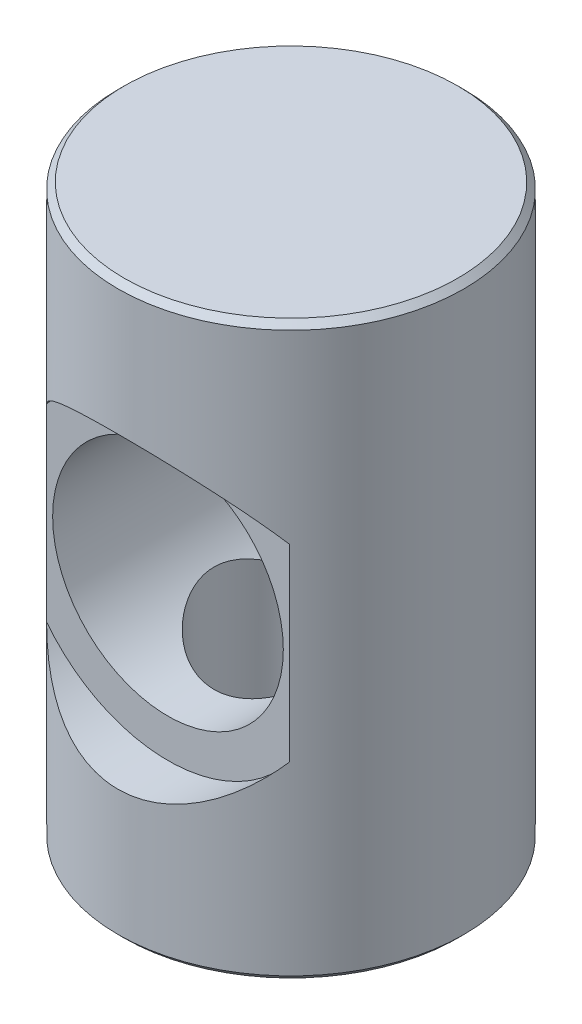
ISO-10303-21;
HEADER;
FILE_DESCRIPTION(('STEP AP214'),'2;1');
FILE_NAME('part.step','',(''),(''),'','','');
FILE_SCHEMA(('AUTOMOTIVE_DESIGN { 1 0 10303 214 1 1 1 1 }'));
ENDSEC;
DATA;
#1=APPLICATION_CONTEXT('core data for automotive mechanical design processes');
#2=APPLICATION_PROTOCOL_DEFINITION('international standard','automotive_design',2000,#1);
#3=PRODUCT_CONTEXT('',#1,'mechanical');
#4=PRODUCT('Part','Part','',(#3));
#5=PRODUCT_RELATED_PRODUCT_CATEGORY('part','',(#4));
#6=PRODUCT_DEFINITION_FORMATION('','',#4);
#7=PRODUCT_DEFINITION_CONTEXT('part definition',#1,'design');
#8=PRODUCT_DEFINITION('design','',#6,#7);
#9=PRODUCT_DEFINITION_SHAPE('','',#8);
#10=(LENGTH_UNIT() NAMED_UNIT(*) SI_UNIT(.MILLI.,.METRE.));
#11=(NAMED_UNIT(*) PLANE_ANGLE_UNIT() SI_UNIT($,.RADIAN.));
#12=(NAMED_UNIT(*) SI_UNIT($,.STERADIAN.) SOLID_ANGLE_UNIT());
#13=UNCERTAINTY_MEASURE_WITH_UNIT(LENGTH_MEASURE(1.E-05),#10,'distance_accuracy_value','');
#14=(GEOMETRIC_REPRESENTATION_CONTEXT(3) GLOBAL_UNCERTAINTY_ASSIGNED_CONTEXT((#13)) GLOBAL_UNIT_ASSIGNED_CONTEXT((#10,
#11,#12)) REPRESENTATION_CONTEXT('',''));
#15=CARTESIAN_POINT('',(0.,0.,0.));
#16=DIRECTION('',(0.,0.,1.));
#17=DIRECTION('',(1.,0.,0.));
#18=AXIS2_PLACEMENT_3D('',#15,#16,#17);
#19=CARTESIAN_POINT('',(0.,11.7983,-7.1755));
#20=DIRECTION('',(0.,0.,1.));
#21=DIRECTION('',(1.,0.,0.));
#22=AXIS2_PLACEMENT_3D('',#19,#20,#21);
#23=CYLINDRICAL_SURFACE('',#22,4.7625);
#24=CARTESIAN_POINT('',(0.,7.0358,-3.175));
#25=CARTESIAN_POINT('',(-0.159513506146526,7.03580170441228,-3.17499785387674));
#26=CARTESIAN_POINT('',(-0.319036822940597,7.04388414018071,-3.16291201378244));
#27=CARTESIAN_POINT('',(-0.632990333269339,7.07541300858027,-3.1153157875296));
#28=CARTESIAN_POINT('',(-0.787418072256469,7.0988667352998,-3.0797942804673));
#29=CARTESIAN_POINT('',(-1.08618661185831,7.15882376063535,-2.98750378332687));
#30=CARTESIAN_POINT('',(-1.23057094564588,7.19526592065314,-2.93083428235375));
#31=CARTESIAN_POINT('',(-1.50719688917279,7.27827251582952,-2.79866196869855));
#32=CARTESIAN_POINT('',(-1.63943673208792,7.32483842051905,-2.72315642160038));
#33=CARTESIAN_POINT('',(-1.90068942785739,7.42906615994305,-2.54848209446027));
#34=CARTESIAN_POINT('',(-2.0284762255929,7.48733425461648,-2.44784901636422));
#35=CARTESIAN_POINT('',(-2.26651828028912,7.60758077610647,-2.22927855246795));
#36=CARTESIAN_POINT('',(-2.37674794067855,7.66956444202943,-2.11131637522972));
#37=CARTESIAN_POINT('',(-2.59432897361932,7.80211379944657,-1.83982936485523));
#38=CARTESIAN_POINT('',(-2.69848308269039,7.87249079681213,-1.68363002512645));
#39=CARTESIAN_POINT('',(-2.87893691841686,8.00283916044992,-1.35197313839848));
#40=CARTESIAN_POINT('',(-2.95528481583058,8.06282842664271,-1.17654958761289));
#41=CARTESIAN_POINT('',(-3.0587003056751,8.14742676712153,-0.862470821626497));
#42=CARTESIAN_POINT('',(-3.09363184983488,8.17725015723145,-0.727823581043087));
#43=CARTESIAN_POINT('',(-3.14564105737718,8.22232973163047,-0.45284309874219));
#44=CARTESIAN_POINT('',(-3.16274949511548,8.23761102114805,-0.312520093909081));
#45=CARTESIAN_POINT('',(-3.17803790572636,8.25124388601104,-0.0294087885536102));
#46=CARTESIAN_POINT('',(-3.17614050629003,8.24952625951566,0.113387224758054));
#47=CARTESIAN_POINT('',(-3.1533716036927,8.22928606406863,0.396295520403466));
#48=CARTESIAN_POINT('',(-3.13248402562585,8.21074925795638,0.536405426371805));
#49=CARTESIAN_POINT('',(-3.07443178311275,8.16090592287372,0.804016443958597));
#50=CARTESIAN_POINT('',(-3.03802591942409,8.13019887455108,0.931801121179951));
#51=CARTESIAN_POINT('',(-2.95068813219861,8.05958473764861,1.17955010979676));
#52=CARTESIAN_POINT('',(-2.89975142875274,8.01967462255611,1.29951183185714));
#53=CARTESIAN_POINT('',(-2.77294687249444,7.92536838190116,1.55420281498847));
#54=CARTESIAN_POINT('',(-2.69411533030023,7.86967695570595,1.68697259197917));
#55=CARTESIAN_POINT('',(-2.51886974692605,7.75507183864348,1.93894614005392));
#56=CARTESIAN_POINT('',(-2.42243402035992,7.69615423703663,2.05813288170832));
#57=CARTESIAN_POINT('',(-2.19045099950254,7.56692441769347,2.30591129113202));
#58=CARTESIAN_POINT('',(-2.05095377025594,7.49689342754584,2.43099280228032));
#59=CARTESIAN_POINT('',(-1.74943769853673,7.36571265195501,2.6561994350834));
#60=CARTESIAN_POINT('',(-1.58744015020742,7.304554579841,2.75634790583761));
#61=CARTESIAN_POINT('',(-1.2777118005163,7.20811671006251,2.91064587831312));
#62=CARTESIAN_POINT('',(-1.13340775885306,7.17011422899626,2.96996383930038));
#63=CARTESIAN_POINT('',(-0.835082219747428,7.10711496039162,3.06721656943045));
#64=CARTESIAN_POINT('',(-0.681069057915085,7.08210718247545,3.10516941057244));
#65=CARTESIAN_POINT('',(-0.366689406911035,7.04729537076046,3.15779334981527));
#66=CARTESIAN_POINT('',(-0.206298501445476,7.03755700592861,3.17236389423949));
#67=CARTESIAN_POINT('',(0.115000912030582,7.03448054992834,3.17697975309251));
#68=CARTESIAN_POINT('',(0.275909383071217,7.04114131225305,3.16702678202589));
#69=CARTESIAN_POINT('',(0.581748451061771,7.06914401788967,3.12479681179543));
#70=CARTESIAN_POINT('',(0.727007443428385,7.08942183855522,3.09413703981371));
#71=CARTESIAN_POINT('',(1.00983477297833,7.14186961760315,3.01371684845446));
#72=CARTESIAN_POINT('',(1.14740187964354,7.17404147251632,2.963953382901));
#73=CARTESIAN_POINT('',(1.42028029136544,7.25017040359987,2.84376447844169));
#74=CARTESIAN_POINT('',(1.55495019310494,7.29472331159536,2.77227005539697));
#75=CARTESIAN_POINT('',(1.81083430052963,7.39137054216631,2.61233715220837));
#76=CARTESIAN_POINT('',(1.93204012275933,7.44346951733385,2.52388820764801));
#77=CARTESIAN_POINT('',(2.17781894704302,7.56039657188094,2.31678500930826));
#78=CARTESIAN_POINT('',(2.29989360271144,7.625934760814,2.19556606216409));
#79=CARTESIAN_POINT('',(2.52307674305786,7.75698262724378,1.93498560490977));
#80=CARTESIAN_POINT('',(2.62417073664107,7.8224922540543,1.79561166279185));
#81=CARTESIAN_POINT('',(2.79598082787364,7.94163259639917,1.51266141984501));
#82=CARTESIAN_POINT('',(2.86854322403869,7.99579939742189,1.37043789728911));
#83=CARTESIAN_POINT('',(2.99237739257787,8.09245628332026,1.07335216383611));
#84=CARTESIAN_POINT('',(3.04368748566418,8.13496733782862,0.918513308918403));
#85=CARTESIAN_POINT('',(3.11524401668582,8.19573532072438,0.627753877826358));
#86=CARTESIAN_POINT('',(3.13941774208684,8.21697940854533,0.493439756093285));
#87=CARTESIAN_POINT('',(3.17022488831674,8.24421346815997,0.221339911640263));
#88=CARTESIAN_POINT('',(3.17687736084457,8.25022000820852,0.0835581242544801));
#89=CARTESIAN_POINT('',(3.17220478264998,8.24604331464361,-0.191520836727935));
#90=CARTESIAN_POINT('',(3.16086908702961,8.23585049469368,-0.328817675150232));
#91=CARTESIAN_POINT('',(3.12097725174618,8.20085903858056,-0.59903291065416));
#92=CARTESIAN_POINT('',(3.09239813794198,8.1760409175349,-0.73194521642847));
#93=CARTESIAN_POINT('',(3.00978981561158,8.10693649259347,-1.02506622898967));
#94=CARTESIAN_POINT('',(2.9510082914772,8.0592247898744,-1.18311132192875));
#95=CARTESIAN_POINT('',(2.8112152810101,7.95302260599703,-1.48508652360585));
#96=CARTESIAN_POINT('',(2.73017258412971,7.89451702973858,-1.62899642711669));
#97=CARTESIAN_POINT('',(2.54632873237354,7.77212940973668,-1.90385549633635));
#98=CARTESIAN_POINT('',(2.44315837250286,7.70816888579323,-2.03452106373605));
#99=CARTESIAN_POINT('',(2.21726660759133,7.58144224984467,-2.27859138405742));
#100=CARTESIAN_POINT('',(2.09453921249742,7.51867651040067,-2.3919908277243));
#101=CARTESIAN_POINT('',(1.88738506601081,7.42496501861292,-2.55491858498312));
#102=CARTESIAN_POINT('',(1.80901344364311,7.39188687451114,-2.61102761986732));
#103=CARTESIAN_POINT('',(1.64665981934885,7.32868094277056,-2.71633779885705));
#104=CARTESIAN_POINT('',(1.56268042207705,7.29855180121786,-2.76554211752335));
#105=CARTESIAN_POINT('',(1.38960715113394,7.24213172927475,-2.85642356224378));
#106=CARTESIAN_POINT('',(1.30051812806184,7.21583723997834,-2.89810767636216));
#107=CARTESIAN_POINT('',(1.11782960098097,7.16787943004951,-2.97335672820606));
#108=CARTESIAN_POINT('',(1.02423169482463,7.14621448338661,-3.00692451716839));
#109=CARTESIAN_POINT('',(0.780235392827382,7.09771890347634,-3.08154139984118));
#110=CARTESIAN_POINT('',(0.627104096318101,7.07467896131736,-3.11642765689178));
#111=CARTESIAN_POINT('',(0.315982580686497,7.04372434712666,-3.16314936096945));
#112=CARTESIAN_POINT('',(0.157996102785211,7.03579831180127,-3.17500212570784));
#113=CARTESIAN_POINT('',(0.,7.0358,-3.175));
#114=B_SPLINE_CURVE_WITH_KNOTS('',3,(#24,#25,#26,#27,#28,#29,#30,#31,#32,#33,#34,#35,#36,#37,
#38,#39,#40,#41,#42,#43,#44,#45,#46,#47,#48,#49,#50,#51,#52,#53,#54,#55,#56,#57,#58,#59,#60,#61,
#62,#63,#64,#65,#66,#67,#68,#69,#70,#71,#72,#73,#74,#75,#76,#77,#78,#79,#80,#81,#82,#83,#84,#85,
#86,#87,#88,#89,#90,#91,#92,#93,#94,#95,#96,#97,#98,#99,#100,#101,#102,#103,#104,#105,#106,#107,
#108,#109,#110,#111,#112,#113),.UNSPECIFIED.,.T.,.F.,(4,2,2,2,2,2,2,2,2,2,2,2,2,2,2,2,2,2,2,2,2,
2,2,2,2,2,2,2,2,2,2,2,2,2,2,2,2,2,2,2,2,2,2,2,4),(0.,0.477921997077322,0.956070945278542,
1.43199826818949,1.90799472139476,2.42438283538384,2.94151703421856,3.54023109732372,
4.13790297394634,4.56300988710696,4.98738156455222,5.41348154879912,5.83994255655571,
6.24758818745149,6.6553680680092,7.14609274784494,7.63742604761198,8.23466340273952,
8.8313393398877,9.31106989228961,9.79039404549573,10.2717740223998,10.7531203456965,
11.2006552211841,11.6482614879236,12.1229810060221,12.5979944723587,13.1481222963466,
13.6986288317687,14.2025677230621,14.7055939480251,15.1181442623597,15.5302458053914,
15.9425913096208,16.3554874162604,16.8784049132826,17.4020593249786,17.9352455177248,
18.4685953331297,18.7739424593009,19.0791487337135,19.3840699212457,19.6888838348845,
20.1626158186784,20.635991489477),.UNSPECIFIED.);
#115=CARTESIAN_POINT('',(0.,7.0358,-3.175));
#116=VERTEX_POINT('',#115);
#117=EDGE_CURVE('E270',#116,#116,#114,.T.);
#118=ORIENTED_EDGE('',*,*,#117,.F.);
#119=EDGE_LOOP('',(#118));
#120=FACE_BOUND('',#119,.T.);
#121=CARTESIAN_POINT('',(0.,11.7983,5.08));
#122=DIRECTION('',(0.,0.,1.));
#123=DIRECTION('',(1.,0.,0.));
#124=AXIS2_PLACEMENT_3D('',#121,#122,#123);
#125=CIRCLE('',#124,4.7625);
#126=CARTESIAN_POINT('',(4.7625,11.7983,5.08));
#127=VERTEX_POINT('',#126);
#128=EDGE_CURVE('E103',#127,#127,#125,.F.);
#129=ORIENTED_EDGE('',*,*,#128,.F.);
#130=EDGE_LOOP('',(#129));
#131=FACE_BOUND('',#130,.T.);
#132=CARTESIAN_POINT('',(0.,11.7983,-5.08));
#133=DIRECTION('',(0.,0.,-1.));
#134=DIRECTION('',(-1.,0.,0.));
#135=AXIS2_PLACEMENT_3D('',#132,#133,#134);
#136=CIRCLE('',#135,4.7625);
#137=CARTESIAN_POINT('',(-4.7625,11.7983,-5.08));
#138=VERTEX_POINT('',#137);
#139=EDGE_CURVE('E93',#138,#138,#136,.F.);
#140=ORIENTED_EDGE('',*,*,#139,.F.);
#141=EDGE_LOOP('',(#140));
#142=FACE_BOUND('',#141,.T.);
#143=ADVANCED_FACE('F34',(#120,#131,#142),#23,.F.);
#144=CARTESIAN_POINT('',(0.,23.5966,0.));
#145=DIRECTION('',(0.,-1.,0.));
#146=DIRECTION('',(0.,0.,-1.));
#147=AXIS2_PLACEMENT_3D('',#144,#145,#146);
#148=CYLINDRICAL_SURFACE('',#147,7.1374);
#149=CARTESIAN_POINT('',(0.,0.254000000000029,0.));
#150=DIRECTION('',(0.,1.,0.));
#151=DIRECTION('',(0.,0.,1.));
#152=AXIS2_PLACEMENT_3D('',#149,#150,#151);
#153=CIRCLE('',#152,7.1374);
#154=CARTESIAN_POINT('',(0.,0.254000000000029,7.1374));
#155=VERTEX_POINT('',#154);
#156=EDGE_CURVE('E108',#155,#155,#153,.T.);
#157=ORIENTED_EDGE('',*,*,#156,.T.);
#158=EDGE_LOOP('',(#157));
#159=FACE_BOUND('',#158,.T.);
#160=CARTESIAN_POINT('',(0.,23.3426,0.));
#161=DIRECTION('',(0.,1.,0.));
#162=DIRECTION('',(0.,0.,1.));
#163=AXIS2_PLACEMENT_3D('',#160,#161,#162);
#164=CIRCLE('',#163,7.1374);
#165=CARTESIAN_POINT('',(0.,23.3426,7.1374));
#166=VERTEX_POINT('',#165);
#167=EDGE_CURVE('E117',#166,#166,#164,.F.);
#168=ORIENTED_EDGE('',*,*,#167,.T.);
#169=EDGE_LOOP('',(#168));
#170=FACE_BOUND('',#169,.T.);
#171=CARTESIAN_POINT('',(-5.01358940879685,7.90132409040035,-5.08));
#172=CARTESIAN_POINT('',(-4.90648502878149,7.7635854557502,-5.18572112331707));
#173=CARTESIAN_POINT('',(-4.79340126510848,7.62976711896911,-5.29062160918102));
#174=CARTESIAN_POINT('',(-4.55495119495651,7.37042044768733,-5.49725219651464));
#175=CARTESIAN_POINT('',(-4.42956630516229,7.24490515077608,-5.59897718542717));
#176=CARTESIAN_POINT('',(-4.16534261279244,7.00195995764851,-5.79827942274049));
#177=CARTESIAN_POINT('',(-4.02639358636565,6.88461234622421,-5.89581147762958));
#178=CARTESIAN_POINT('',(-3.73603214738952,6.66038346600335,-6.08394902937854));
#179=CARTESIAN_POINT('',(-3.58462764087743,6.55349565083927,-6.17455885069701));
#180=CARTESIAN_POINT('',(-3.30484095874253,6.37413138754628,-6.32771116138449));
#181=CARTESIAN_POINT('',(-3.17890733179915,6.29931260825521,-6.39199186687382));
#182=CARTESIAN_POINT('',(-2.91986390451783,6.1574943321378,-6.51439819586154));
#183=CARTESIAN_POINT('',(-2.78675581887783,6.09049297895258,-6.57252528031964));
#184=CARTESIAN_POINT('',(-2.51408311019655,5.96526186954583,-6.68156925084875));
#185=CARTESIAN_POINT('',(-2.37453585805806,5.90701013276477,-6.73250418486546));
#186=CARTESIAN_POINT('',(-2.08934089764727,5.79993872343358,-6.82639397690769));
#187=CARTESIAN_POINT('',(-1.94369640414868,5.75111415475468,-6.86935297689583));
#188=CARTESIAN_POINT('',(-1.64553210440703,5.66322656410037,-6.94684607284315));
#189=CARTESIAN_POINT('',(-1.4929564949888,5.62427049120682,-6.9812877752731));
#190=CARTESIAN_POINT('',(-1.18349538064518,5.55755583556956,-7.04035693557952));
#191=CARTESIAN_POINT('',(-1.02660982587839,5.52979738237651,-7.06498427990892));
#192=CARTESIAN_POINT('',(-0.709944239539988,5.48608801235782,-7.10379460252081));
#193=CARTESIAN_POINT('',(-0.550164702351688,5.47013509790566,-7.11797934780339));
#194=CARTESIAN_POINT('',(-0.229273485295923,5.45040573077873,-7.13552517406307));
#195=CARTESIAN_POINT('',(-0.0681620062038429,5.44662747529184,-7.13888785756089));
#196=CARTESIAN_POINT('',(0.230766370769881,5.45099296800301,-7.13500426528504));
#197=CARTESIAN_POINT('',(0.368630338438482,5.45751415121553,-7.12920184013348));
#198=CARTESIAN_POINT('',(0.6431307810693,5.47945159506404,-7.10969750208706));
#199=CARTESIAN_POINT('',(0.779766849102553,5.49487070155182,-7.09599306186613));
#200=CARTESIAN_POINT('',(1.05070985095515,5.53433676593677,-7.06095823796117));
#201=CARTESIAN_POINT('',(1.18501810993927,5.55837863386231,-7.03963235320292));
#202=CARTESIAN_POINT('',(1.45054761727503,5.61470361470149,-6.9897549592306));
#203=CARTESIAN_POINT('',(1.58176766356226,5.64698988058266,-6.96120068564527));
#204=CARTESIAN_POINT('',(1.96800874114835,5.75508252052344,-6.86580612170238));
#205=CARTESIAN_POINT('',(2.21747402764985,5.84240339109374,-6.78898310323563));
#206=CARTESIAN_POINT('',(2.69706982116865,6.04363474646974,-6.61315009165441));
#207=CARTESIAN_POINT('',(2.92718188163154,6.15757021698519,-6.51411925341828));
#208=CARTESIAN_POINT('',(3.30732336353376,6.37442563536606,-6.32741826965322));
#209=CARTESIAN_POINT('',(3.46234707064988,6.47218382464702,-6.24375842699735));
#210=CARTESIAN_POINT('',(3.7605476018623,6.678374219184,-6.06882487582275));
#211=CARTESIAN_POINT('',(3.90372369116022,6.78680708557983,-5.9775506957609));
#212=CARTESIAN_POINT('',(4.17814401405553,7.01319072783886,-5.78906859105549));
#213=CARTESIAN_POINT('',(4.30938568729903,7.13114353586888,-5.69185940058389));
#214=CARTESIAN_POINT('',(4.55994561370261,7.37562905751948,-5.49316976050202));
#215=CARTESIAN_POINT('',(4.67927004152543,7.50215727033194,-5.39169156193111));
#216=CARTESIAN_POINT('',(4.83088286586266,7.67659470989879,-5.25430357798406));
#217=CARTESIAN_POINT('',(4.86838888602788,7.72096543118581,-5.21956343792526));
#218=CARTESIAN_POINT('',(4.94200849827078,7.81051812940347,-5.14991187275229));
#219=CARTESIAN_POINT('',(4.97812467523291,7.85569834596996,-5.11500091676728));
#220=CARTESIAN_POINT('',(5.0135894087969,7.90132409040031,-5.08));
#221=B_SPLINE_CURVE_WITH_KNOTS('',3,(#171,#172,#173,#174,#175,#176,#177,#178,#179,#180,#181,
#182,#183,#184,#185,#186,#187,#188,#189,#190,#191,#192,#193,#194,#195,#196,#197,#198,#199,#200,
#201,#202,#203,#204,#205,#206,#207,#208,#209,#210,#211,#212,#213,#214,#215,#216,#217,#218,#219,
#220),.UNSPECIFIED.,.F.,.F.,(4,2,2,2,2,2,2,2,2,2,2,2,2,2,2,2,2,2,2,2,2,2,2,2,4),(0.,
0.612006445663398,1.2249521193373,1.84337572784972,2.46140978061607,2.94088458183679,
3.42024529222186,3.89838086544293,4.37626744047922,4.85913060401934,5.34199935387605,
5.82478637835434,6.30750190889455,6.7214125983357,7.13545574361017,7.54925488252654,
7.96321251141351,8.78549152442383,9.60854561525155,10.2121657150913,10.8158232238985,
11.419609934532,12.0230821652517,12.2261478476827,12.4288155525972),.UNSPECIFIED.);
#222=CARTESIAN_POINT('',(-5.01358940879685,7.90132409040035,-5.08));
#223=VERTEX_POINT('',#222);
#224=CARTESIAN_POINT('',(5.01358940879685,7.90132409040035,-5.08));
#225=VERTEX_POINT('',#224);
#226=EDGE_CURVE('E11',#223,#225,#221,.T.);
#227=ORIENTED_EDGE('',*,*,#226,.T.);
#228=DIRECTION('',(0.,-1.,0.));
#229=VECTOR('',#228,1.);
#230=CARTESIAN_POINT('',(5.01358940879685,23.5966,-5.08));
#231=LINE('',#230,#229);
#232=CARTESIAN_POINT('',(5.01358940879685,15.6952759095996,-5.08));
#233=VERTEX_POINT('',#232);
#234=EDGE_CURVE('E91',#233,#225,#231,.T.);
#235=ORIENTED_EDGE('',*,*,#234,.F.);
#236=CARTESIAN_POINT('',(5.01358940879685,15.6952759095996,-5.08));
#237=CARTESIAN_POINT('',(4.90648502878149,15.8330145442498,-5.18572112331707));
#238=CARTESIAN_POINT('',(4.79340126510848,15.9668328810309,-5.29062160918102));
#239=CARTESIAN_POINT('',(4.55495119495651,16.2261795523127,-5.49725219651464));
#240=CARTESIAN_POINT('',(4.42956630516229,16.3516948492239,-5.59897718542717));
#241=CARTESIAN_POINT('',(4.16534261279244,16.5946400423515,-5.79827942274049));
#242=CARTESIAN_POINT('',(4.02639358636565,16.7119876537758,-5.89581147762958));
#243=CARTESIAN_POINT('',(3.73603214738952,16.9362165339966,-6.08394902937854));
#244=CARTESIAN_POINT('',(3.58462764087743,17.0431043491607,-6.174558850697));
#245=CARTESIAN_POINT('',(3.30484095874253,17.2224686124537,-6.32771116138449));
#246=CARTESIAN_POINT('',(3.17890733179915,17.2972873917448,-6.39199186687382));
#247=CARTESIAN_POINT('',(2.91986390451783,17.4391056678622,-6.51439819586154));
#248=CARTESIAN_POINT('',(2.78675581887783,17.5061070210474,-6.57252528031964));
#249=CARTESIAN_POINT('',(2.51408311019655,17.6313381304542,-6.68156925084875));
#250=CARTESIAN_POINT('',(2.37453585805806,17.6895898672352,-6.73250418486546));
#251=CARTESIAN_POINT('',(2.08934089764727,17.7966612765664,-6.82639397690769));
#252=CARTESIAN_POINT('',(1.94369640414868,17.8454858452453,-6.86935297689583));
#253=CARTESIAN_POINT('',(1.64553210440703,17.9333734358996,-6.94684607284315));
#254=CARTESIAN_POINT('',(1.4929564949888,17.9723295087932,-6.9812877752731));
#255=CARTESIAN_POINT('',(1.18349538064518,18.0390441644304,-7.04035693557952));
#256=CARTESIAN_POINT('',(1.02660982587839,18.0668026176235,-7.06498427990892));
#257=CARTESIAN_POINT('',(0.709944239539987,18.1105119876422,-7.10379460252081));
#258=CARTESIAN_POINT('',(0.550164702351688,18.1264649020943,-7.11797934780339));
#259=CARTESIAN_POINT('',(0.229273485295923,18.1461942692213,-7.13552517406307));
#260=CARTESIAN_POINT('',(0.0681620062038422,18.1499725247082,-7.13888785756089));
#261=CARTESIAN_POINT('',(-0.230766370769882,18.145607031997,-7.13500426528504));
#262=CARTESIAN_POINT('',(-0.368630338438483,18.1390858487845,-7.12920184013348));
#263=CARTESIAN_POINT('',(-0.643130781069301,18.117148404936,-7.10969750208706));
#264=CARTESIAN_POINT('',(-0.779766849102554,18.1017292984482,-7.09599306186613));
#265=CARTESIAN_POINT('',(-1.05070985095516,18.0622632340632,-7.06095823796117));
#266=CARTESIAN_POINT('',(-1.18501810993928,18.0382213661377,-7.03963235320292));
#267=CARTESIAN_POINT('',(-1.45054761727503,17.9818963852985,-6.9897549592306));
#268=CARTESIAN_POINT('',(-1.58176766356226,17.9496101194173,-6.96120068564527));
#269=CARTESIAN_POINT('',(-1.96800874114835,17.8415174794766,-6.86580612170238));
#270=CARTESIAN_POINT('',(-2.21747402764985,17.7541966089063,-6.78898310323563));
#271=CARTESIAN_POINT('',(-2.69706982116865,17.5529652535303,-6.61315009165441));
#272=CARTESIAN_POINT('',(-2.92718188163154,17.4390297830148,-6.51411925341828));
#273=CARTESIAN_POINT('',(-3.30732336353376,17.2221743646339,-6.32741826965322));
#274=CARTESIAN_POINT('',(-3.46234707064988,17.124416175353,-6.24375842699735));
#275=CARTESIAN_POINT('',(-3.7605476018623,16.918225780816,-6.06882487582275));
#276=CARTESIAN_POINT('',(-3.90372369116022,16.8097929144202,-5.9775506957609));
#277=CARTESIAN_POINT('',(-4.17814401405552,16.5834092721611,-5.78906859105549));
#278=CARTESIAN_POINT('',(-4.30938568729903,16.4654564641311,-5.69185940058389));
#279=CARTESIAN_POINT('',(-4.55994561370261,16.2209709424805,-5.49316976050203));
#280=CARTESIAN_POINT('',(-4.67927004152543,16.0944427296681,-5.39169156193111));
#281=CARTESIAN_POINT('',(-4.83088286586265,15.9200052901012,-5.25430357798406));
#282=CARTESIAN_POINT('',(-4.86838888602788,15.8756345688142,-5.21956343792526));
#283=CARTESIAN_POINT('',(-4.94200849827078,15.7860818705965,-5.14991187275229));
#284=CARTESIAN_POINT('',(-4.97812467523291,15.74090165403,-5.11500091676728));
#285=CARTESIAN_POINT('',(-5.0135894087969,15.6952759095997,-5.08));
#286=B_SPLINE_CURVE_WITH_KNOTS('',3,(#236,#237,#238,#239,#240,#241,#242,#243,#244,#245,#246,
#247,#248,#249,#250,#251,#252,#253,#254,#255,#256,#257,#258,#259,#260,#261,#262,#263,#264,#265,
#266,#267,#268,#269,#270,#271,#272,#273,#274,#275,#276,#277,#278,#279,#280,#281,#282,#283,#284,
#285),.UNSPECIFIED.,.F.,.F.,(4,2,2,2,2,2,2,2,2,2,2,2,2,2,2,2,2,2,2,2,2,2,2,2,4),(0.,
0.612006445663398,1.2249521193373,1.84337572784972,2.46140978061607,2.94088458183679,
3.42024529222186,3.89838086544293,4.37626744047922,4.85913060401934,5.34199935387605,
5.82478637835434,6.30750190889455,6.7214125983357,7.13545574361017,7.54925488252654,
7.96321251141351,8.78549152442383,9.60854561525155,10.2121657150913,10.8158232238984,
11.419609934532,12.0230821652517,12.2261478476827,12.4288155525972),.UNSPECIFIED.);
#287=CARTESIAN_POINT('',(-5.01358940879685,15.6952759095996,-5.08));
#288=VERTEX_POINT('',#287);
#289=EDGE_CURVE('E49',#233,#288,#286,.T.);
#290=ORIENTED_EDGE('',*,*,#289,.T.);
#291=DIRECTION('',(0.,-1.,0.));
#292=VECTOR('',#291,1.);
#293=CARTESIAN_POINT('',(-5.01358940879685,23.5966,-5.08));
#294=LINE('',#293,#292);
#295=EDGE_CURVE('E92',#223,#288,#294,.F.);
#296=ORIENTED_EDGE('',*,*,#295,.F.);
#297=EDGE_LOOP('',(#227,#235,#290,#296));
#298=FACE_BOUND('',#297,.T.);
#299=DIRECTION('',(0.,-1.,0.));
#300=VECTOR('',#299,1.);
#301=CARTESIAN_POINT('',(-5.01358940879685,23.5966,5.08));
#302=LINE('',#301,#300);
#303=CARTESIAN_POINT('',(-5.01358940879685,15.6952759095996,5.08));
#304=VERTEX_POINT('',#303);
#305=CARTESIAN_POINT('',(-5.01358940879685,7.90132409040035,5.08));
#306=VERTEX_POINT('',#305);
#307=EDGE_CURVE('E106',#304,#306,#302,.T.);
#308=ORIENTED_EDGE('',*,*,#307,.F.);
#309=CARTESIAN_POINT('',(5.01358940879685,15.6952759095996,5.08));
#310=CARTESIAN_POINT('',(4.90648502878149,15.8330145442498,5.18572112331707));
#311=CARTESIAN_POINT('',(4.79340126510848,15.9668328810309,5.29062160918102));
#312=CARTESIAN_POINT('',(4.55495119495651,16.2261795523127,5.49725219651464));
#313=CARTESIAN_POINT('',(4.42956630516229,16.3516948492239,5.59897718542717));
#314=CARTESIAN_POINT('',(4.16534261279244,16.5946400423515,5.79827942274049));
#315=CARTESIAN_POINT('',(4.02639358636565,16.7119876537758,5.89581147762958));
#316=CARTESIAN_POINT('',(3.73603214738952,16.9362165339966,6.08394902937854));
#317=CARTESIAN_POINT('',(3.58462764087743,17.0431043491607,6.174558850697));
#318=CARTESIAN_POINT('',(3.30484095874253,17.2224686124537,6.32771116138449));
#319=CARTESIAN_POINT('',(3.17890733179915,17.2972873917448,6.39199186687382));
#320=CARTESIAN_POINT('',(2.91986390451783,17.4391056678622,6.51439819586154));
#321=CARTESIAN_POINT('',(2.78675581887783,17.5061070210474,6.57252528031964));
#322=CARTESIAN_POINT('',(2.51408311019655,17.6313381304542,6.68156925084875));
#323=CARTESIAN_POINT('',(2.37453585805806,17.6895898672352,6.73250418486546));
#324=CARTESIAN_POINT('',(2.08934089764727,17.7966612765664,6.82639397690769));
#325=CARTESIAN_POINT('',(1.94369640414868,17.8454858452453,6.86935297689583));
#326=CARTESIAN_POINT('',(1.64553210440703,17.9333734358996,6.94684607284315));
#327=CARTESIAN_POINT('',(1.4929564949888,17.9723295087932,6.9812877752731));
#328=CARTESIAN_POINT('',(1.18349538064518,18.0390441644304,7.04035693557952));
#329=CARTESIAN_POINT('',(1.02660982587839,18.0668026176235,7.06498427990892));
#330=CARTESIAN_POINT('',(0.709944239539987,18.1105119876422,7.10379460252081));
#331=CARTESIAN_POINT('',(0.550164702351688,18.1264649020943,7.11797934780339));
#332=CARTESIAN_POINT('',(0.229273485295923,18.1461942692213,7.13552517406307));
#333=CARTESIAN_POINT('',(0.0681620062038422,18.1499725247082,7.13888785756089));
#334=CARTESIAN_POINT('',(-0.230766370769882,18.145607031997,7.13500426528504));
#335=CARTESIAN_POINT('',(-0.368630338438483,18.1390858487845,7.12920184013348));
#336=CARTESIAN_POINT('',(-0.643130781069301,18.117148404936,7.10969750208706));
#337=CARTESIAN_POINT('',(-0.779766849102554,18.1017292984482,7.09599306186613));
#338=CARTESIAN_POINT('',(-1.05070985095516,18.0622632340632,7.06095823796117));
#339=CARTESIAN_POINT('',(-1.18501810993928,18.0382213661377,7.03963235320292));
#340=CARTESIAN_POINT('',(-1.45054761727503,17.9818963852985,6.9897549592306));
#341=CARTESIAN_POINT('',(-1.58176766356226,17.9496101194173,6.96120068564527));
#342=CARTESIAN_POINT('',(-1.96800874114835,17.8415174794766,6.86580612170238));
#343=CARTESIAN_POINT('',(-2.21747402764985,17.7541966089063,6.78898310323563));
#344=CARTESIAN_POINT('',(-2.69706982116865,17.5529652535303,6.61315009165441));
#345=CARTESIAN_POINT('',(-2.92718188163154,17.4390297830148,6.51411925341828));
#346=CARTESIAN_POINT('',(-3.30732336353376,17.2221743646339,6.32741826965322));
#347=CARTESIAN_POINT('',(-3.46234707064988,17.124416175353,6.24375842699735));
#348=CARTESIAN_POINT('',(-3.7605476018623,16.918225780816,6.06882487582275));
#349=CARTESIAN_POINT('',(-3.90372369116022,16.8097929144202,5.9775506957609));
#350=CARTESIAN_POINT('',(-4.17814401405552,16.5834092721611,5.78906859105549));
#351=CARTESIAN_POINT('',(-4.30938568729903,16.4654564641311,5.69185940058389));
#352=CARTESIAN_POINT('',(-4.55994561370261,16.2209709424805,5.49316976050203));
#353=CARTESIAN_POINT('',(-4.67927004152543,16.0944427296681,5.39169156193111));
#354=CARTESIAN_POINT('',(-4.83088286586265,15.9200052901012,5.25430357798406));
#355=CARTESIAN_POINT('',(-4.86838888602788,15.8756345688142,5.21956343792526));
#356=CARTESIAN_POINT('',(-4.94200849827078,15.7860818705965,5.14991187275229));
#357=CARTESIAN_POINT('',(-4.97812467523291,15.74090165403,5.11500091676728));
#358=CARTESIAN_POINT('',(-5.0135894087969,15.6952759095997,5.08));
#359=B_SPLINE_CURVE_WITH_KNOTS('',3,(#309,#310,#311,#312,#313,#314,#315,#316,#317,#318,#319,
#320,#321,#322,#323,#324,#325,#326,#327,#328,#329,#330,#331,#332,#333,#334,#335,#336,#337,#338,
#339,#340,#341,#342,#343,#344,#345,#346,#347,#348,#349,#350,#351,#352,#353,#354,#355,#356,#357,
#358),.UNSPECIFIED.,.F.,.F.,(4,2,2,2,2,2,2,2,2,2,2,2,2,2,2,2,2,2,2,2,2,2,2,2,4),(0.,
0.612006445663398,1.2249521193373,1.84337572784972,2.46140978061607,2.94088458183679,
3.42024529222186,3.89838086544293,4.37626744047922,4.85913060401934,5.34199935387605,
5.82478637835434,6.30750190889455,6.7214125983357,7.13545574361017,7.54925488252654,
7.96321251141351,8.78549152442383,9.60854561525155,10.2121657150913,10.8158232238984,
11.419609934532,12.0230821652517,12.2261478476827,12.4288155525972),.UNSPECIFIED.);
#360=CARTESIAN_POINT('',(5.01358940879685,15.6952759095996,5.08));
#361=VERTEX_POINT('',#360);
#362=EDGE_CURVE('E89',#361,#304,#359,.T.);
#363=ORIENTED_EDGE('',*,*,#362,.F.);
#364=DIRECTION('',(0.,-1.,0.));
#365=VECTOR('',#364,1.);
#366=CARTESIAN_POINT('',(5.01358940879685,23.5966,5.08));
#367=LINE('',#366,#365);
#368=CARTESIAN_POINT('',(5.01358940879685,7.90132409040035,5.08));
#369=VERTEX_POINT('',#368);
#370=EDGE_CURVE('E104',#369,#361,#367,.F.);
#371=ORIENTED_EDGE('',*,*,#370,.F.);
#372=CARTESIAN_POINT('',(-5.01358940879685,7.90132409040035,5.08));
#373=CARTESIAN_POINT('',(-4.90648502878149,7.7635854557502,5.18572112331707));
#374=CARTESIAN_POINT('',(-4.79340126510848,7.62976711896911,5.29062160918102));
#375=CARTESIAN_POINT('',(-4.55495119495651,7.37042044768733,5.49725219651464));
#376=CARTESIAN_POINT('',(-4.42956630516229,7.24490515077608,5.59897718542717));
#377=CARTESIAN_POINT('',(-4.16534261279244,7.00195995764851,5.79827942274049));
#378=CARTESIAN_POINT('',(-4.02639358636565,6.88461234622421,5.89581147762958));
#379=CARTESIAN_POINT('',(-3.73603214738952,6.66038346600335,6.08394902937854));
#380=CARTESIAN_POINT('',(-3.58462764087743,6.55349565083927,6.17455885069701));
#381=CARTESIAN_POINT('',(-3.30484095874253,6.37413138754628,6.32771116138449));
#382=CARTESIAN_POINT('',(-3.17890733179915,6.29931260825521,6.39199186687382));
#383=CARTESIAN_POINT('',(-2.91986390451783,6.1574943321378,6.51439819586154));
#384=CARTESIAN_POINT('',(-2.78675581887783,6.09049297895258,6.57252528031964));
#385=CARTESIAN_POINT('',(-2.51408311019655,5.96526186954583,6.68156925084875));
#386=CARTESIAN_POINT('',(-2.37453585805806,5.90701013276477,6.73250418486546));
#387=CARTESIAN_POINT('',(-2.08934089764727,5.79993872343358,6.82639397690769));
#388=CARTESIAN_POINT('',(-1.94369640414868,5.75111415475468,6.86935297689583));
#389=CARTESIAN_POINT('',(-1.64553210440703,5.66322656410037,6.94684607284315));
#390=CARTESIAN_POINT('',(-1.4929564949888,5.62427049120682,6.9812877752731));
#391=CARTESIAN_POINT('',(-1.18349538064518,5.55755583556956,7.04035693557952));
#392=CARTESIAN_POINT('',(-1.02660982587839,5.52979738237651,7.06498427990892));
#393=CARTESIAN_POINT('',(-0.709944239539988,5.48608801235782,7.10379460252081));
#394=CARTESIAN_POINT('',(-0.550164702351688,5.47013509790566,7.11797934780339));
#395=CARTESIAN_POINT('',(-0.229273485295923,5.45040573077873,7.13552517406307));
#396=CARTESIAN_POINT('',(-0.0681620062038429,5.44662747529184,7.13888785756089));
#397=CARTESIAN_POINT('',(0.230766370769881,5.45099296800301,7.13500426528504));
#398=CARTESIAN_POINT('',(0.368630338438482,5.45751415121553,7.12920184013348));
#399=CARTESIAN_POINT('',(0.6431307810693,5.47945159506404,7.10969750208706));
#400=CARTESIAN_POINT('',(0.779766849102553,5.49487070155182,7.09599306186613));
#401=CARTESIAN_POINT('',(1.05070985095515,5.53433676593677,7.06095823796117));
#402=CARTESIAN_POINT('',(1.18501810993927,5.55837863386231,7.03963235320292));
#403=CARTESIAN_POINT('',(1.45054761727503,5.61470361470149,6.9897549592306));
#404=CARTESIAN_POINT('',(1.58176766356226,5.64698988058266,6.96120068564527));
#405=CARTESIAN_POINT('',(1.96800874114835,5.75508252052344,6.86580612170238));
#406=CARTESIAN_POINT('',(2.21747402764985,5.84240339109374,6.78898310323563));
#407=CARTESIAN_POINT('',(2.69706982116865,6.04363474646974,6.61315009165441));
#408=CARTESIAN_POINT('',(2.92718188163154,6.15757021698519,6.51411925341828));
#409=CARTESIAN_POINT('',(3.30732336353376,6.37442563536606,6.32741826965322));
#410=CARTESIAN_POINT('',(3.46234707064988,6.47218382464702,6.24375842699735));
#411=CARTESIAN_POINT('',(3.7605476018623,6.678374219184,6.06882487582275));
#412=CARTESIAN_POINT('',(3.90372369116022,6.78680708557983,5.9775506957609));
#413=CARTESIAN_POINT('',(4.17814401405553,7.01319072783886,5.78906859105549));
#414=CARTESIAN_POINT('',(4.30938568729903,7.13114353586888,5.69185940058389));
#415=CARTESIAN_POINT('',(4.55994561370261,7.37562905751948,5.49316976050202));
#416=CARTESIAN_POINT('',(4.67927004152543,7.50215727033194,5.39169156193111));
#417=CARTESIAN_POINT('',(4.83088286586266,7.67659470989879,5.25430357798406));
#418=CARTESIAN_POINT('',(4.86838888602788,7.72096543118581,5.21956343792526));
#419=CARTESIAN_POINT('',(4.94200849827078,7.81051812940347,5.14991187275229));
#420=CARTESIAN_POINT('',(4.97812467523291,7.85569834596996,5.11500091676728));
#421=CARTESIAN_POINT('',(5.0135894087969,7.90132409040031,5.08));
#422=B_SPLINE_CURVE_WITH_KNOTS('',3,(#372,#373,#374,#375,#376,#377,#378,#379,#380,#381,#382,
#383,#384,#385,#386,#387,#388,#389,#390,#391,#392,#393,#394,#395,#396,#397,#398,#399,#400,#401,
#402,#403,#404,#405,#406,#407,#408,#409,#410,#411,#412,#413,#414,#415,#416,#417,#418,#419,#420,
#421),.UNSPECIFIED.,.F.,.F.,(4,2,2,2,2,2,2,2,2,2,2,2,2,2,2,2,2,2,2,2,2,2,2,2,4),(0.,
0.612006445663398,1.2249521193373,1.84337572784972,2.46140978061607,2.94088458183679,
3.42024529222186,3.89838086544293,4.37626744047922,4.85913060401934,5.34199935387605,
5.82478637835434,6.30750190889455,6.7214125983357,7.13545574361017,7.54925488252654,
7.96321251141351,8.78549152442383,9.60854561525155,10.2121657150913,10.8158232238985,
11.419609934532,12.0230821652517,12.2261478476827,12.4288155525972),.UNSPECIFIED.);
#423=EDGE_CURVE('E120',#306,#369,#422,.T.);
#424=ORIENTED_EDGE('',*,*,#423,.F.);
#425=EDGE_LOOP('',(#308,#363,#371,#424));
#426=FACE_BOUND('',#425,.T.);
#427=ADVANCED_FACE('F95',(#159,#170,#298,#426),#148,.T.);
#428=CARTESIAN_POINT('',(0.,23.5966,0.));
#429=DIRECTION('',(0.,1.,0.));
#430=DIRECTION('',(0.,0.,1.));
#431=AXIS2_PLACEMENT_3D('',#428,#429,#430);
#432=PLANE('',#431);
#433=CARTESIAN_POINT('',(0.,23.5966,0.));
#434=DIRECTION('',(0.,1.,0.));
#435=DIRECTION('',(0.,0.,1.));
#436=AXIS2_PLACEMENT_3D('',#433,#434,#435);
#437=CIRCLE('',#436,6.88340000000002);
#438=CARTESIAN_POINT('',(0.,23.5966,6.88340000000002));
#439=VERTEX_POINT('',#438);
#440=EDGE_CURVE('E114',#439,#439,#437,.T.);
#441=ORIENTED_EDGE('',*,*,#440,.T.);
#442=EDGE_LOOP('',(#441));
#443=FACE_BOUND('',#442,.T.);
#444=ADVANCED_FACE('F148',(#443),#432,.T.);
#445=CARTESIAN_POINT('',(0.,0.,0.));
#446=DIRECTION('',(0.,1.,0.));
#447=DIRECTION('',(0.,0.,1.));
#448=AXIS2_PLACEMENT_3D('',#445,#446,#447);
#449=PLANE('',#448);
#450=CARTESIAN_POINT('',(0.,0.,0.));
#451=DIRECTION('',(0.,-1.,0.));
#452=DIRECTION('',(0.,0.,-1.));
#453=AXIS2_PLACEMENT_3D('',#450,#451,#452);
#454=CIRCLE('',#453,3.175);
#455=CARTESIAN_POINT('',(0.,0.,-3.175));
#456=VERTEX_POINT('',#455);
#457=EDGE_CURVE('E162',#456,#456,#454,.T.);
#458=ORIENTED_EDGE('',*,*,#457,.F.);
#459=EDGE_LOOP('',(#458));
#460=FACE_BOUND('',#459,.T.);
#461=CARTESIAN_POINT('',(0.,0.,0.));
#462=DIRECTION('',(0.,1.,0.));
#463=DIRECTION('',(0.,0.,1.));
#464=AXIS2_PLACEMENT_3D('',#461,#462,#463);
#465=CIRCLE('',#464,6.88339999999997);
#466=CARTESIAN_POINT('',(0.,0.,6.88339999999997));
#467=VERTEX_POINT('',#466);
#468=EDGE_CURVE('E111',#467,#467,#465,.F.);
#469=ORIENTED_EDGE('',*,*,#468,.T.);
#470=EDGE_LOOP('',(#469));
#471=FACE_BOUND('',#470,.T.);
#472=ADVANCED_FACE('F150',(#460,#471),#449,.F.);
#473=CARTESIAN_POINT('',(0.,0.254000000000029,0.));
#474=DIRECTION('',(0.,1.,0.));
#475=DIRECTION('',(0.,0.,1.));
#476=AXIS2_PLACEMENT_3D('',#473,#474,#475);
#477=CONICAL_SURFACE('',#476,7.1374,0.785398163397447);
#478=ORIENTED_EDGE('',*,*,#468,.F.);
#479=EDGE_LOOP('',(#478));
#480=FACE_BOUND('',#479,.T.);
#481=ORIENTED_EDGE('',*,*,#156,.F.);
#482=EDGE_LOOP('',(#481));
#483=FACE_BOUND('',#482,.T.);
#484=ADVANCED_FACE('F153',(#480,#483),#477,.T.);
#485=CARTESIAN_POINT('',(0.,23.5966,0.));
#486=DIRECTION('',(0.,-1.,0.));
#487=DIRECTION('',(0.,0.,-1.));
#488=AXIS2_PLACEMENT_3D('',#485,#486,#487);
#489=CONICAL_SURFACE('',#488,6.88340000000002,0.785398163397447);
#490=ORIENTED_EDGE('',*,*,#167,.F.);
#491=EDGE_LOOP('',(#490));
#492=FACE_BOUND('',#491,.T.);
#493=ORIENTED_EDGE('',*,*,#440,.F.);
#494=EDGE_LOOP('',(#493));
#495=FACE_BOUND('',#494,.T.);
#496=ADVANCED_FACE('F37',(#492,#495),#489,.T.);
#497=CARTESIAN_POINT('',(0.,11.7983,7.1374));
#498=DIRECTION('',(0.,0.,-1.));
#499=DIRECTION('',(-1.,0.,0.));
#500=AXIS2_PLACEMENT_3D('',#497,#498,#499);
#501=CYLINDRICAL_SURFACE('',#500,6.35);
#502=ORIENTED_EDGE('',*,*,#362,.T.);
#503=CARTESIAN_POINT('',(0.,11.7983,5.08));
#504=DIRECTION('',(0.,0.,1.));
#505=DIRECTION('',(1.,0.,0.));
#506=AXIS2_PLACEMENT_3D('',#503,#504,#505);
#507=CIRCLE('',#506,6.35);
#508=EDGE_CURVE('E98',#361,#304,#507,.T.);
#509=ORIENTED_EDGE('',*,*,#508,.F.);
#510=EDGE_LOOP('',(#502,#509));
#511=FACE_BOUND('',#510,.T.);
#512=ADVANCED_FACE('F136',(#511),#501,.F.);
#513=EDGE_CURVE('E64',#306,#369,#507,.T.);
#514=ORIENTED_EDGE('',*,*,#513,.F.);
#515=ORIENTED_EDGE('',*,*,#423,.T.);
#516=EDGE_LOOP('',(#514,#515));
#517=FACE_BOUND('',#516,.T.);
#518=ADVANCED_FACE('F141',(#517),#501,.F.);
#519=CARTESIAN_POINT('',(0.,11.7983,5.08));
#520=DIRECTION('',(0.,0.,1.));
#521=DIRECTION('',(1.,0.,0.));
#522=AXIS2_PLACEMENT_3D('',#519,#520,#521);
#523=PLANE('',#522);
#524=ORIENTED_EDGE('',*,*,#128,.T.);
#525=EDGE_LOOP('',(#524));
#526=FACE_BOUND('',#525,.T.);
#527=ORIENTED_EDGE('',*,*,#307,.T.);
#528=ORIENTED_EDGE('',*,*,#513,.T.);
#529=ORIENTED_EDGE('',*,*,#370,.T.);
#530=ORIENTED_EDGE('',*,*,#508,.T.);
#531=EDGE_LOOP('',(#527,#528,#529,#530));
#532=FACE_BOUND('',#531,.T.);
#533=ADVANCED_FACE('F143',(#526,#532),#523,.T.);
#534=CARTESIAN_POINT('',(0.,11.7983,-7.1374));
#535=DIRECTION('',(0.,0.,1.));
#536=DIRECTION('',(1.,0.,0.));
#537=AXIS2_PLACEMENT_3D('',#534,#535,#536);
#538=CYLINDRICAL_SURFACE('',#537,6.35);
#539=CARTESIAN_POINT('',(0.,11.7983,-5.08));
#540=DIRECTION('',(0.,0.,1.));
#541=DIRECTION('',(1.,0.,0.));
#542=AXIS2_PLACEMENT_3D('',#539,#540,#541);
#543=CIRCLE('',#542,6.35);
#544=EDGE_CURVE('E56',#223,#225,#543,.T.);
#545=ORIENTED_EDGE('',*,*,#544,.T.);
#546=ORIENTED_EDGE('',*,*,#226,.F.);
#547=EDGE_LOOP('',(#545,#546));
#548=FACE_BOUND('',#547,.T.);
#549=ADVANCED_FACE('F195',(#548),#538,.F.);
#550=EDGE_CURVE('E85',#233,#288,#543,.T.);
#551=ORIENTED_EDGE('',*,*,#550,.T.);
#552=ORIENTED_EDGE('',*,*,#289,.F.);
#553=EDGE_LOOP('',(#551,#552));
#554=FACE_BOUND('',#553,.T.);
#555=ADVANCED_FACE('F84',(#554),#538,.F.);
#556=CARTESIAN_POINT('',(0.,11.7983,-5.08));
#557=DIRECTION('',(0.,0.,-1.));
#558=DIRECTION('',(1.,0.,0.));
#559=AXIS2_PLACEMENT_3D('',#556,#557,#558);
#560=PLANE('',#559);
#561=ORIENTED_EDGE('',*,*,#139,.T.);
#562=EDGE_LOOP('',(#561));
#563=FACE_BOUND('',#562,.T.);
#564=ORIENTED_EDGE('',*,*,#234,.T.);
#565=ORIENTED_EDGE('',*,*,#544,.F.);
#566=ORIENTED_EDGE('',*,*,#295,.T.);
#567=ORIENTED_EDGE('',*,*,#550,.F.);
#568=EDGE_LOOP('',(#564,#565,#566,#567));
#569=FACE_BOUND('',#568,.T.);
#570=ADVANCED_FACE('F90',(#563,#569),#560,.T.);
#571=CARTESIAN_POINT('',(0.,23.5976,0.));
#572=DIRECTION('',(0.,-1.,0.));
#573=DIRECTION('',(0.,0.,-1.));
#574=AXIS2_PLACEMENT_3D('',#571,#572,#573);
#575=CYLINDRICAL_SURFACE('',#574,3.175);
#576=ORIENTED_EDGE('',*,*,#457,.T.);
#577=EDGE_LOOP('',(#576));
#578=FACE_BOUND('',#577,.T.);
#579=ORIENTED_EDGE('',*,*,#117,.T.);
#580=EDGE_LOOP('',(#579));
#581=FACE_BOUND('',#580,.T.);
#582=ADVANCED_FACE('F214',(#578,#581),#575,.F.);
#583=CLOSED_SHELL('',(#143,#427,#444,#472,#484,#496,#512,#518,#533,#549,#555,#570,#582));
#584=MANIFOLD_SOLID_BREP('B2',#583);
#585=ADVANCED_BREP_SHAPE_REPRESENTATION('',(#18,#584),#14);
#586=SHAPE_DEFINITION_REPRESENTATION(#9,#585);
ENDSEC;
END-ISO-10303-21;
